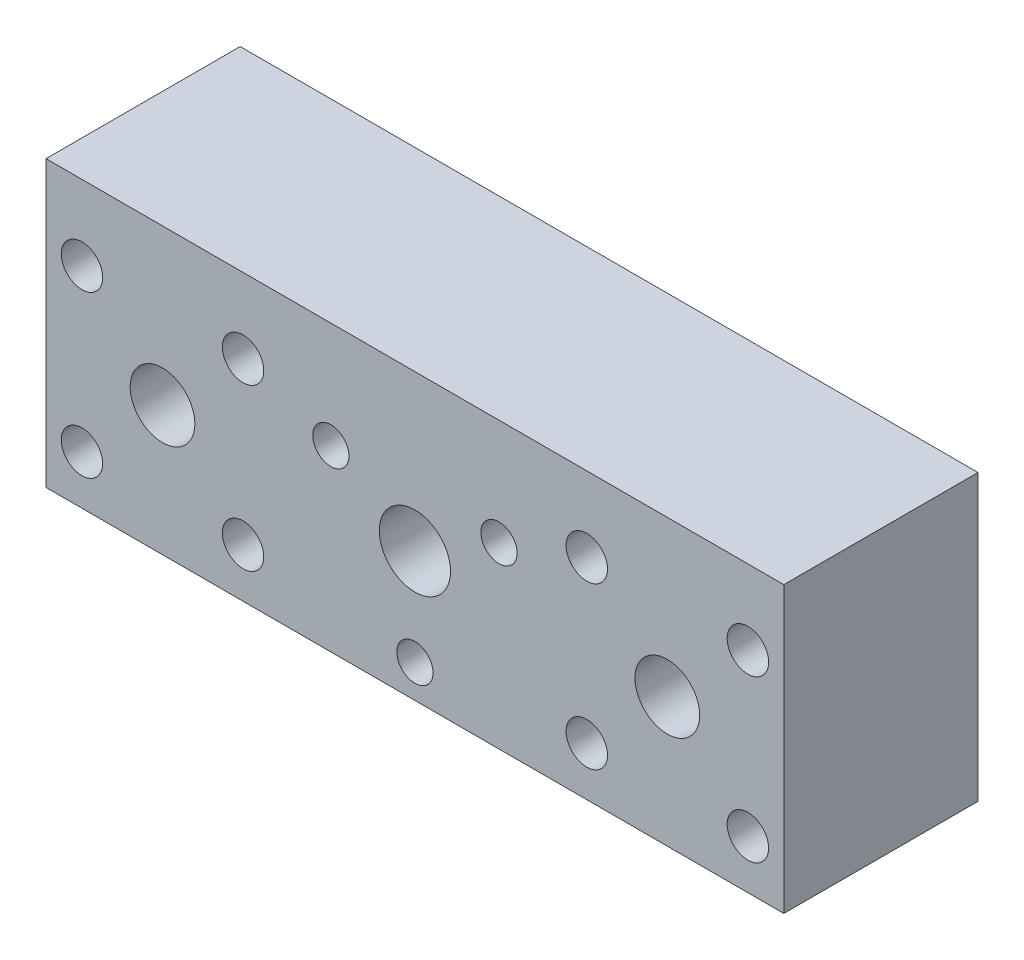
ISO-10303-21;
HEADER;
FILE_DESCRIPTION(('STEP AP214'),'2;1');
FILE_NAME('part.step','',(''),(''),'','','');
FILE_SCHEMA(('AUTOMOTIVE_DESIGN { 1 0 10303 214 1 1 1 1 }'));
ENDSEC;
DATA;
#1=APPLICATION_CONTEXT('core data for automotive mechanical design processes');
#2=APPLICATION_PROTOCOL_DEFINITION('international standard','automotive_design',2000,#1);
#3=PRODUCT_CONTEXT('',#1,'mechanical');
#4=PRODUCT('Part','Part','',(#3));
#5=PRODUCT_RELATED_PRODUCT_CATEGORY('part','',(#4));
#6=PRODUCT_DEFINITION_FORMATION('','',#4);
#7=PRODUCT_DEFINITION_CONTEXT('part definition',#1,'design');
#8=PRODUCT_DEFINITION('design','',#6,#7);
#9=PRODUCT_DEFINITION_SHAPE('','',#8);
#10=(LENGTH_UNIT() NAMED_UNIT(*) SI_UNIT(.MILLI.,.METRE.));
#11=(NAMED_UNIT(*) PLANE_ANGLE_UNIT() SI_UNIT($,.RADIAN.));
#12=(NAMED_UNIT(*) SI_UNIT($,.STERADIAN.) SOLID_ANGLE_UNIT());
#13=UNCERTAINTY_MEASURE_WITH_UNIT(LENGTH_MEASURE(1.E-05),#10,'distance_accuracy_value','');
#14=(GEOMETRIC_REPRESENTATION_CONTEXT(3) GLOBAL_UNCERTAINTY_ASSIGNED_CONTEXT((#13)) GLOBAL_UNIT_ASSIGNED_CONTEXT((#10,
#11,#12)) REPRESENTATION_CONTEXT('',''));
#15=CARTESIAN_POINT('',(0.,0.,0.));
#16=DIRECTION('',(0.,0.,1.));
#17=DIRECTION('',(1.,0.,0.));
#18=AXIS2_PLACEMENT_3D('',#15,#16,#17);
#19=CARTESIAN_POINT('',(-36.195,11.43,6.35));
#20=DIRECTION('',(1.,0.,0.));
#21=DIRECTION('',(0.,0.,-1.));
#22=AXIS2_PLACEMENT_3D('',#19,#20,#21);
#23=PLANE('',#22);
#24=DIRECTION('',(0.,0.,1.));
#25=VECTOR('',#24,1.);
#26=CARTESIAN_POINT('',(-36.195,15.24,0.));
#27=LINE('',#26,#25);
#28=CARTESIAN_POINT('',(-36.195,15.24,-12.7));
#29=VERTEX_POINT('',#28);
#30=CARTESIAN_POINT('',(-36.195,15.24,6.35));
#31=VERTEX_POINT('',#30);
#32=EDGE_CURVE('E86',#29,#31,#27,.T.);
#33=ORIENTED_EDGE('',*,*,#32,.F.);
#34=DIRECTION('',(0.,1.,0.));
#35=VECTOR('',#34,1.);
#36=CARTESIAN_POINT('',(-36.195,15.24,-12.7));
#37=LINE('',#36,#35);
#38=CARTESIAN_POINT('',(-36.195,-12.7,-12.7));
#39=VERTEX_POINT('',#38);
#40=EDGE_CURVE('E87',#39,#29,#37,.T.);
#41=ORIENTED_EDGE('',*,*,#40,.F.);
#42=DIRECTION('',(0.,0.,-1.));
#43=VECTOR('',#42,1.);
#44=CARTESIAN_POINT('',(-36.195,-12.7,6.35));
#45=LINE('',#44,#43);
#46=CARTESIAN_POINT('',(-36.195,-12.7,6.35));
#47=VERTEX_POINT('',#46);
#48=EDGE_CURVE('E120',#47,#39,#45,.T.);
#49=ORIENTED_EDGE('',*,*,#48,.F.);
#50=DIRECTION('',(0.,-1.,0.));
#51=VECTOR('',#50,1.);
#52=CARTESIAN_POINT('',(-36.195,11.43,6.35));
#53=LINE('',#52,#51);
#54=EDGE_CURVE('E47',#31,#47,#53,.T.);
#55=ORIENTED_EDGE('',*,*,#54,.F.);
#56=EDGE_LOOP('',(#33,#41,#49,#55));
#57=FACE_BOUND('',#56,.T.);
#58=ADVANCED_FACE('F39',(#57),#23,.F.);
#59=CARTESIAN_POINT('',(36.195,11.43,6.35));
#60=DIRECTION('',(1.,0.,0.));
#61=DIRECTION('',(0.,0.,-1.));
#62=AXIS2_PLACEMENT_3D('',#59,#60,#61);
#63=PLANE('',#62);
#64=DIRECTION('',(0.,0.,1.));
#65=VECTOR('',#64,1.);
#66=CARTESIAN_POINT('',(36.195,-12.7,0.));
#67=LINE('',#66,#65);
#68=CARTESIAN_POINT('',(36.195,-12.7,-12.7));
#69=VERTEX_POINT('',#68);
#70=CARTESIAN_POINT('',(36.195,-12.7,6.35));
#71=VERTEX_POINT('',#70);
#72=EDGE_CURVE('E92',#69,#71,#67,.T.);
#73=ORIENTED_EDGE('',*,*,#72,.F.);
#74=DIRECTION('',(0.,-1.,0.));
#75=VECTOR('',#74,1.);
#76=CARTESIAN_POINT('',(36.195,15.24,-12.7));
#77=LINE('',#76,#75);
#78=CARTESIAN_POINT('',(36.195,15.24,-12.7));
#79=VERTEX_POINT('',#78);
#80=EDGE_CURVE('E90',#79,#69,#77,.T.);
#81=ORIENTED_EDGE('',*,*,#80,.F.);
#82=DIRECTION('',(0.,0.,-1.));
#83=VECTOR('',#82,1.);
#84=CARTESIAN_POINT('',(36.195,15.24,6.35));
#85=LINE('',#84,#83);
#86=CARTESIAN_POINT('',(36.195,15.24,6.35));
#87=VERTEX_POINT('',#86);
#88=EDGE_CURVE('E78',#87,#79,#85,.T.);
#89=ORIENTED_EDGE('',*,*,#88,.F.);
#90=DIRECTION('',(0.,-1.,0.));
#91=VECTOR('',#90,1.);
#92=CARTESIAN_POINT('',(36.195,11.43,6.35));
#93=LINE('',#92,#91);
#94=EDGE_CURVE('E11',#87,#71,#93,.T.);
#95=ORIENTED_EDGE('',*,*,#94,.T.);
#96=EDGE_LOOP('',(#73,#81,#89,#95));
#97=FACE_BOUND('',#96,.T.);
#98=ADVANCED_FACE('F91',(#97),#63,.T.);
#99=CARTESIAN_POINT('',(0.,0.,6.35));
#100=DIRECTION('',(0.,0.,1.));
#101=DIRECTION('',(1.,0.,0.));
#102=AXIS2_PLACEMENT_3D('',#99,#100,#101);
#103=PLANE('',#102);
#104=CARTESIAN_POINT('',(8.24864999999999,4.826,6.35));
#105=DIRECTION('',(0.,0.,1.));
#106=DIRECTION('',(1.,0.,0.));
#107=AXIS2_PLACEMENT_3D('',#104,#105,#106);
#108=CIRCLE('',#107,1.778);
#109=CARTESIAN_POINT('',(10.02665,4.826,6.35));
#110=VERTEX_POINT('',#109);
#111=EDGE_CURVE('E134',#110,#110,#108,.T.);
#112=ORIENTED_EDGE('',*,*,#111,.F.);
#113=EDGE_LOOP('',(#112));
#114=FACE_BOUND('',#113,.T.);
#115=CARTESIAN_POINT('',(-8.24865000000001,4.826,6.35));
#116=DIRECTION('',(0.,0.,1.));
#117=DIRECTION('',(1.,0.,0.));
#118=AXIS2_PLACEMENT_3D('',#115,#116,#117);
#119=CIRCLE('',#118,1.778);
#120=CARTESIAN_POINT('',(-6.47065000000001,4.826,6.35));
#121=VERTEX_POINT('',#120);
#122=EDGE_CURVE('E142',#121,#121,#119,.T.);
#123=ORIENTED_EDGE('',*,*,#122,.F.);
#124=EDGE_LOOP('',(#123));
#125=FACE_BOUND('',#124,.T.);
#126=CARTESIAN_POINT('',(0.,-9.46108089385302,6.35));
#127=DIRECTION('',(0.,0.,1.));
#128=DIRECTION('',(1.,0.,0.));
#129=AXIS2_PLACEMENT_3D('',#126,#127,#128);
#130=CIRCLE('',#129,1.778);
#131=CARTESIAN_POINT('',(1.778,-9.46108089385302,6.35));
#132=VERTEX_POINT('',#131);
#133=EDGE_CURVE('E128',#132,#132,#130,.T.);
#134=ORIENTED_EDGE('',*,*,#133,.F.);
#135=EDGE_LOOP('',(#134));
#136=FACE_BOUND('',#135,.T.);
#137=CARTESIAN_POINT('',(-16.862374613459,7.90262538654075,6.35));
#138=DIRECTION('',(0.,0.,1.));
#139=DIRECTION('',(-1.,0.,0.));
#140=AXIS2_PLACEMENT_3D('',#137,#138,#139);
#141=CIRCLE('',#140,2.032);
#142=CARTESIAN_POINT('',(-18.894374613459,7.90262538654075,6.35));
#143=VERTEX_POINT('',#142);
#144=EDGE_CURVE('E165',#143,#143,#141,.T.);
#145=ORIENTED_EDGE('',*,*,#144,.F.);
#146=EDGE_LOOP('',(#145));
#147=FACE_BOUND('',#146,.T.);
#148=CARTESIAN_POINT('',(16.862374613459,-7.90262538654075,6.35));
#149=DIRECTION('',(0.,0.,1.));
#150=DIRECTION('',(-1.,0.,0.));
#151=AXIS2_PLACEMENT_3D('',#148,#149,#150);
#152=CIRCLE('',#151,2.032);
#153=CARTESIAN_POINT('',(14.830374613459,-7.90262538654075,6.35));
#154=VERTEX_POINT('',#153);
#155=EDGE_CURVE('E182',#154,#154,#152,.T.);
#156=ORIENTED_EDGE('',*,*,#155,.F.);
#157=EDGE_LOOP('',(#156));
#158=FACE_BOUND('',#157,.T.);
#159=CARTESIAN_POINT('',(16.862374613459,7.90262538654075,6.35));
#160=DIRECTION('',(0.,0.,1.));
#161=DIRECTION('',(1.,0.,0.));
#162=AXIS2_PLACEMENT_3D('',#159,#160,#161);
#163=CIRCLE('',#162,2.032);
#164=CARTESIAN_POINT('',(18.894374613459,7.90262538654075,6.35));
#165=VERTEX_POINT('',#164);
#166=EDGE_CURVE('E181',#165,#165,#163,.T.);
#167=ORIENTED_EDGE('',*,*,#166,.F.);
#168=EDGE_LOOP('',(#167));
#169=FACE_BOUND('',#168,.T.);
#170=CARTESIAN_POINT('',(32.667625386541,7.90262538654075,6.35));
#171=DIRECTION('',(0.,0.,1.));
#172=DIRECTION('',(-1.,0.,0.));
#173=AXIS2_PLACEMENT_3D('',#170,#171,#172);
#174=CIRCLE('',#173,2.032);
#175=CARTESIAN_POINT('',(30.635625386541,7.90262538654075,6.35));
#176=VERTEX_POINT('',#175);
#177=EDGE_CURVE('E198',#176,#176,#174,.T.);
#178=ORIENTED_EDGE('',*,*,#177,.F.);
#179=EDGE_LOOP('',(#178));
#180=FACE_BOUND('',#179,.T.);
#181=CARTESIAN_POINT('',(-32.667625386541,-7.90262538654075,6.35));
#182=DIRECTION('',(0.,0.,1.));
#183=DIRECTION('',(-1.,0.,0.));
#184=AXIS2_PLACEMENT_3D('',#181,#182,#183);
#185=CIRCLE('',#184,2.032);
#186=CARTESIAN_POINT('',(-34.699625386541,-7.90262538654075,6.35));
#187=VERTEX_POINT('',#186);
#188=EDGE_CURVE('E133',#187,#187,#185,.T.);
#189=ORIENTED_EDGE('',*,*,#188,.F.);
#190=EDGE_LOOP('',(#189));
#191=FACE_BOUND('',#190,.T.);
#192=CARTESIAN_POINT('',(-16.862374613459,-7.90262538654075,6.35));
#193=DIRECTION('',(0.,0.,1.));
#194=DIRECTION('',(1.,0.,0.));
#195=AXIS2_PLACEMENT_3D('',#192,#193,#194);
#196=CIRCLE('',#195,2.032);
#197=CARTESIAN_POINT('',(-14.830374613459,-7.90262538654075,6.35));
#198=VERTEX_POINT('',#197);
#199=EDGE_CURVE('E157',#198,#198,#196,.T.);
#200=ORIENTED_EDGE('',*,*,#199,.F.);
#201=EDGE_LOOP('',(#200));
#202=FACE_BOUND('',#201,.T.);
#203=CARTESIAN_POINT('',(-32.667625386541,7.90262538654075,6.35));
#204=DIRECTION('',(0.,0.,1.));
#205=DIRECTION('',(1.,0.,0.));
#206=AXIS2_PLACEMENT_3D('',#203,#204,#205);
#207=CIRCLE('',#206,2.032);
#208=CARTESIAN_POINT('',(-30.635625386541,7.90262538654075,6.35));
#209=VERTEX_POINT('',#208);
#210=EDGE_CURVE('E166',#209,#209,#207,.T.);
#211=ORIENTED_EDGE('',*,*,#210,.F.);
#212=EDGE_LOOP('',(#211));
#213=FACE_BOUND('',#212,.T.);
#214=CARTESIAN_POINT('',(32.667625386541,-7.90262538654075,6.35));
#215=DIRECTION('',(0.,0.,1.));
#216=DIRECTION('',(1.,0.,0.));
#217=AXIS2_PLACEMENT_3D('',#214,#215,#216);
#218=CIRCLE('',#217,2.032);
#219=CARTESIAN_POINT('',(34.699625386541,-7.90262538654075,6.35));
#220=VERTEX_POINT('',#219);
#221=EDGE_CURVE('E197',#220,#220,#218,.T.);
#222=ORIENTED_EDGE('',*,*,#221,.F.);
#223=EDGE_LOOP('',(#222));
#224=FACE_BOUND('',#223,.T.);
#225=CARTESIAN_POINT('',(-24.765,0.,6.35));
#226=DIRECTION('',(0.,0.,1.));
#227=DIRECTION('',(1.,0.,0.));
#228=AXIS2_PLACEMENT_3D('',#225,#226,#227);
#229=CIRCLE('',#228,3.175);
#230=CARTESIAN_POINT('',(-21.59,0.,6.35));
#231=VERTEX_POINT('',#230);
#232=EDGE_CURVE('E224',#231,#231,#229,.F.);
#233=ORIENTED_EDGE('',*,*,#232,.T.);
#234=EDGE_LOOP('',(#233));
#235=FACE_BOUND('',#234,.T.);
#236=CARTESIAN_POINT('',(24.765,0.,6.35));
#237=DIRECTION('',(0.,0.,1.));
#238=DIRECTION('',(1.,0.,0.));
#239=AXIS2_PLACEMENT_3D('',#236,#237,#238);
#240=CIRCLE('',#239,3.175);
#241=CARTESIAN_POINT('',(27.94,0.,6.35));
#242=VERTEX_POINT('',#241);
#243=EDGE_CURVE('E220',#242,#242,#240,.F.);
#244=ORIENTED_EDGE('',*,*,#243,.T.);
#245=EDGE_LOOP('',(#244));
#246=FACE_BOUND('',#245,.T.);
#247=CARTESIAN_POINT('',(0.,0.,6.35));
#248=DIRECTION('',(0.,0.,1.));
#249=DIRECTION('',(1.,0.,0.));
#250=AXIS2_PLACEMENT_3D('',#247,#248,#249);
#251=CIRCLE('',#250,3.4925);
#252=CARTESIAN_POINT('',(3.4925,0.,6.35));
#253=VERTEX_POINT('',#252);
#254=EDGE_CURVE('E213',#253,#253,#251,.F.);
#255=ORIENTED_EDGE('',*,*,#254,.T.);
#256=EDGE_LOOP('',(#255));
#257=FACE_BOUND('',#256,.T.);
#258=ORIENTED_EDGE('',*,*,#54,.T.);
#259=DIRECTION('',(-1.,0.,0.));
#260=VECTOR('',#259,1.);
#261=CARTESIAN_POINT('',(36.195,-12.7,6.35));
#262=LINE('',#261,#260);
#263=EDGE_CURVE('E125',#71,#47,#262,.T.);
#264=ORIENTED_EDGE('',*,*,#263,.F.);
#265=ORIENTED_EDGE('',*,*,#94,.F.);
#266=DIRECTION('',(1.,0.,0.));
#267=VECTOR('',#266,1.);
#268=CARTESIAN_POINT('',(-36.195,15.24,6.35));
#269=LINE('',#268,#267);
#270=EDGE_CURVE('E84',#31,#87,#269,.T.);
#271=ORIENTED_EDGE('',*,*,#270,.F.);
#272=EDGE_LOOP('',(#258,#264,#265,#271));
#273=FACE_BOUND('',#272,.T.);
#274=ADVANCED_FACE('F230',(#114,#125,#136,#147,#158,#169,#180,#191,#202,#213,#224,#235,#246,
#257,#273),#103,.T.);
#275=CARTESIAN_POINT('',(0.,0.,12.7));
#276=DIRECTION('',(0.,0.,-1.));
#277=DIRECTION('',(-1.,0.,0.));
#278=AXIS2_PLACEMENT_3D('',#275,#276,#277);
#279=CYLINDRICAL_SURFACE('',#278,3.4925);
#280=ORIENTED_EDGE('',*,*,#254,.F.);
#281=EDGE_LOOP('',(#280));
#282=FACE_BOUND('',#281,.T.);
#283=CARTESIAN_POINT('',(0.,0.,-12.7));
#284=DIRECTION('',(0.,0.,-1.));
#285=DIRECTION('',(-1.,0.,0.));
#286=AXIS2_PLACEMENT_3D('',#283,#284,#285);
#287=CIRCLE('',#286,3.4925);
#288=CARTESIAN_POINT('',(-3.4925,0.,-12.7));
#289=VERTEX_POINT('',#288);
#290=EDGE_CURVE('E108',#289,#289,#287,.T.);
#291=ORIENTED_EDGE('',*,*,#290,.T.);
#292=EDGE_LOOP('',(#291));
#293=FACE_BOUND('',#292,.T.);
#294=ADVANCED_FACE('F249',(#282,#293),#279,.F.);
#295=CARTESIAN_POINT('',(24.765,0.,12.7));
#296=DIRECTION('',(0.,0.,-1.));
#297=DIRECTION('',(-1.,0.,0.));
#298=AXIS2_PLACEMENT_3D('',#295,#296,#297);
#299=CYLINDRICAL_SURFACE('',#298,3.175);
#300=ORIENTED_EDGE('',*,*,#243,.F.);
#301=EDGE_LOOP('',(#300));
#302=FACE_BOUND('',#301,.T.);
#303=CARTESIAN_POINT('',(24.765,0.,-12.7));
#304=DIRECTION('',(0.,0.,-1.));
#305=DIRECTION('',(-1.,0.,0.));
#306=AXIS2_PLACEMENT_3D('',#303,#304,#305);
#307=CIRCLE('',#306,3.175);
#308=CARTESIAN_POINT('',(21.59,0.,-12.7));
#309=VERTEX_POINT('',#308);
#310=EDGE_CURVE('E104',#309,#309,#307,.T.);
#311=ORIENTED_EDGE('',*,*,#310,.T.);
#312=EDGE_LOOP('',(#311));
#313=FACE_BOUND('',#312,.T.);
#314=ADVANCED_FACE('F237',(#302,#313),#299,.F.);
#315=CARTESIAN_POINT('',(-24.765,0.,12.7));
#316=DIRECTION('',(0.,0.,-1.));
#317=DIRECTION('',(-1.,0.,0.));
#318=AXIS2_PLACEMENT_3D('',#315,#316,#317);
#319=CYLINDRICAL_SURFACE('',#318,3.175);
#320=ORIENTED_EDGE('',*,*,#232,.F.);
#321=EDGE_LOOP('',(#320));
#322=FACE_BOUND('',#321,.T.);
#323=CARTESIAN_POINT('',(-24.765,0.,-12.7));
#324=DIRECTION('',(0.,0.,-1.));
#325=DIRECTION('',(-1.,0.,0.));
#326=AXIS2_PLACEMENT_3D('',#323,#324,#325);
#327=CIRCLE('',#326,3.175);
#328=CARTESIAN_POINT('',(-27.94,0.,-12.7));
#329=VERTEX_POINT('',#328);
#330=EDGE_CURVE('E241',#329,#329,#327,.T.);
#331=ORIENTED_EDGE('',*,*,#330,.T.);
#332=EDGE_LOOP('',(#331));
#333=FACE_BOUND('',#332,.T.);
#334=ADVANCED_FACE('F233',(#322,#333),#319,.F.);
#335=CARTESIAN_POINT('',(32.667625386541,-7.90262538654075,0.));
#336=DIRECTION('',(0.,0.,1.));
#337=DIRECTION('',(1.,0.,0.));
#338=AXIS2_PLACEMENT_3D('',#335,#336,#337);
#339=CYLINDRICAL_SURFACE('',#338,2.032);
#340=CARTESIAN_POINT('',(32.667625386541,-7.90262538654075,0.));
#341=DIRECTION('',(0.,0.,1.));
#342=DIRECTION('',(1.,0.,0.));
#343=AXIS2_PLACEMENT_3D('',#340,#341,#342);
#344=CIRCLE('',#343,2.032);
#345=CARTESIAN_POINT('',(34.699625386541,-7.90262538654075,0.));
#346=VERTEX_POINT('',#345);
#347=EDGE_CURVE('E209',#346,#346,#344,.T.);
#348=ORIENTED_EDGE('',*,*,#347,.F.);
#349=EDGE_LOOP('',(#348));
#350=FACE_BOUND('',#349,.T.);
#351=ORIENTED_EDGE('',*,*,#221,.T.);
#352=EDGE_LOOP('',(#351));
#353=FACE_BOUND('',#352,.T.);
#354=ADVANCED_FACE('F236',(#350,#353),#339,.F.);
#355=CARTESIAN_POINT('',(-32.667625386541,7.90262538654075,0.));
#356=DIRECTION('',(0.,0.,1.));
#357=DIRECTION('',(1.,0.,0.));
#358=AXIS2_PLACEMENT_3D('',#355,#356,#357);
#359=CYLINDRICAL_SURFACE('',#358,2.032);
#360=CARTESIAN_POINT('',(-32.667625386541,7.90262538654075,0.));
#361=DIRECTION('',(0.,0.,1.));
#362=DIRECTION('',(1.,0.,0.));
#363=AXIS2_PLACEMENT_3D('',#360,#361,#362);
#364=CIRCLE('',#363,2.032);
#365=CARTESIAN_POINT('',(-30.635625386541,7.90262538654075,0.));
#366=VERTEX_POINT('',#365);
#367=EDGE_CURVE('E161',#366,#366,#364,.T.);
#368=ORIENTED_EDGE('',*,*,#367,.F.);
#369=EDGE_LOOP('',(#368));
#370=FACE_BOUND('',#369,.T.);
#371=ORIENTED_EDGE('',*,*,#210,.T.);
#372=EDGE_LOOP('',(#371));
#373=FACE_BOUND('',#372,.T.);
#374=ADVANCED_FACE('F295',(#370,#373),#359,.F.);
#375=CARTESIAN_POINT('',(-16.862374613459,-7.90262538654075,0.));
#376=DIRECTION('',(0.,0.,1.));
#377=DIRECTION('',(1.,0.,0.));
#378=AXIS2_PLACEMENT_3D('',#375,#376,#377);
#379=CYLINDRICAL_SURFACE('',#378,2.032);
#380=CARTESIAN_POINT('',(-16.862374613459,-7.90262538654075,0.));
#381=DIRECTION('',(0.,0.,1.));
#382=DIRECTION('',(1.,0.,0.));
#383=AXIS2_PLACEMENT_3D('',#380,#381,#382);
#384=CIRCLE('',#383,2.032);
#385=CARTESIAN_POINT('',(-14.830374613459,-7.90262538654075,0.));
#386=VERTEX_POINT('',#385);
#387=EDGE_CURVE('E170',#386,#386,#384,.T.);
#388=ORIENTED_EDGE('',*,*,#387,.F.);
#389=EDGE_LOOP('',(#388));
#390=FACE_BOUND('',#389,.T.);
#391=ORIENTED_EDGE('',*,*,#199,.T.);
#392=EDGE_LOOP('',(#391));
#393=FACE_BOUND('',#392,.T.);
#394=ADVANCED_FACE('F293',(#390,#393),#379,.F.);
#395=CARTESIAN_POINT('',(-32.667625386541,-7.90262538654075,0.));
#396=DIRECTION('',(0.,0.,1.));
#397=DIRECTION('',(1.,0.,0.));
#398=AXIS2_PLACEMENT_3D('',#395,#396,#397);
#399=CYLINDRICAL_SURFACE('',#398,2.032);
#400=CARTESIAN_POINT('',(-32.667625386541,-7.90262538654075,0.));
#401=DIRECTION('',(0.,0.,1.));
#402=DIRECTION('',(-1.,0.,0.));
#403=AXIS2_PLACEMENT_3D('',#400,#401,#402);
#404=CIRCLE('',#403,2.032);
#405=CARTESIAN_POINT('',(-34.699625386541,-7.90262538654075,0.));
#406=VERTEX_POINT('',#405);
#407=EDGE_CURVE('E153',#406,#406,#404,.T.);
#408=ORIENTED_EDGE('',*,*,#407,.F.);
#409=EDGE_LOOP('',(#408));
#410=FACE_BOUND('',#409,.T.);
#411=ORIENTED_EDGE('',*,*,#188,.T.);
#412=EDGE_LOOP('',(#411));
#413=FACE_BOUND('',#412,.T.);
#414=ADVANCED_FACE('F289',(#410,#413),#399,.F.);
#415=CARTESIAN_POINT('',(32.667625386541,7.90262538654075,0.));
#416=DIRECTION('',(0.,0.,1.));
#417=DIRECTION('',(1.,0.,0.));
#418=AXIS2_PLACEMENT_3D('',#415,#416,#417);
#419=CYLINDRICAL_SURFACE('',#418,2.032);
#420=CARTESIAN_POINT('',(32.667625386541,7.90262538654075,0.));
#421=DIRECTION('',(0.,0.,1.));
#422=DIRECTION('',(-1.,0.,0.));
#423=AXIS2_PLACEMENT_3D('',#420,#421,#422);
#424=CIRCLE('',#423,2.032);
#425=CARTESIAN_POINT('',(30.635625386541,7.90262538654075,0.));
#426=VERTEX_POINT('',#425);
#427=EDGE_CURVE('E193',#426,#426,#424,.T.);
#428=ORIENTED_EDGE('',*,*,#427,.F.);
#429=EDGE_LOOP('',(#428));
#430=FACE_BOUND('',#429,.T.);
#431=ORIENTED_EDGE('',*,*,#177,.T.);
#432=EDGE_LOOP('',(#431));
#433=FACE_BOUND('',#432,.T.);
#434=ADVANCED_FACE('F292',(#430,#433),#419,.F.);
#435=CARTESIAN_POINT('',(16.862374613459,7.90262538654075,0.));
#436=DIRECTION('',(0.,0.,1.));
#437=DIRECTION('',(1.,0.,0.));
#438=AXIS2_PLACEMENT_3D('',#435,#436,#437);
#439=CYLINDRICAL_SURFACE('',#438,2.032);
#440=CARTESIAN_POINT('',(16.862374613459,7.90262538654075,0.));
#441=DIRECTION('',(0.,0.,1.));
#442=DIRECTION('',(1.,0.,0.));
#443=AXIS2_PLACEMENT_3D('',#440,#441,#442);
#444=CIRCLE('',#443,2.032);
#445=CARTESIAN_POINT('',(18.894374613459,7.90262538654075,0.));
#446=VERTEX_POINT('',#445);
#447=EDGE_CURVE('E202',#446,#446,#444,.T.);
#448=ORIENTED_EDGE('',*,*,#447,.F.);
#449=EDGE_LOOP('',(#448));
#450=FACE_BOUND('',#449,.T.);
#451=ORIENTED_EDGE('',*,*,#166,.T.);
#452=EDGE_LOOP('',(#451));
#453=FACE_BOUND('',#452,.T.);
#454=ADVANCED_FACE('F305',(#450,#453),#439,.F.);
#455=CARTESIAN_POINT('',(16.862374613459,-7.90262538654075,0.));
#456=DIRECTION('',(0.,0.,1.));
#457=DIRECTION('',(1.,0.,0.));
#458=AXIS2_PLACEMENT_3D('',#455,#456,#457);
#459=CYLINDRICAL_SURFACE('',#458,2.032);
#460=CARTESIAN_POINT('',(16.862374613459,-7.90262538654075,0.));
#461=DIRECTION('',(0.,0.,1.));
#462=DIRECTION('',(-1.,0.,0.));
#463=AXIS2_PLACEMENT_3D('',#460,#461,#462);
#464=CIRCLE('',#463,2.032);
#465=CARTESIAN_POINT('',(14.830374613459,-7.90262538654075,0.));
#466=VERTEX_POINT('',#465);
#467=EDGE_CURVE('E177',#466,#466,#464,.T.);
#468=ORIENTED_EDGE('',*,*,#467,.F.);
#469=EDGE_LOOP('',(#468));
#470=FACE_BOUND('',#469,.T.);
#471=ORIENTED_EDGE('',*,*,#155,.T.);
#472=EDGE_LOOP('',(#471));
#473=FACE_BOUND('',#472,.T.);
#474=ADVANCED_FACE('F302',(#470,#473),#459,.F.);
#475=CARTESIAN_POINT('',(-16.862374613459,7.90262538654075,0.));
#476=DIRECTION('',(0.,0.,1.));
#477=DIRECTION('',(1.,0.,0.));
#478=AXIS2_PLACEMENT_3D('',#475,#476,#477);
#479=CYLINDRICAL_SURFACE('',#478,2.032);
#480=CARTESIAN_POINT('',(-16.862374613459,7.90262538654075,0.));
#481=DIRECTION('',(0.,0.,1.));
#482=DIRECTION('',(-1.,0.,0.));
#483=AXIS2_PLACEMENT_3D('',#480,#481,#482);
#484=CIRCLE('',#483,2.032);
#485=CARTESIAN_POINT('',(-18.894374613459,7.90262538654075,0.));
#486=VERTEX_POINT('',#485);
#487=EDGE_CURVE('E186',#486,#486,#484,.T.);
#488=ORIENTED_EDGE('',*,*,#487,.F.);
#489=EDGE_LOOP('',(#488));
#490=FACE_BOUND('',#489,.T.);
#491=ORIENTED_EDGE('',*,*,#144,.T.);
#492=EDGE_LOOP('',(#491));
#493=FACE_BOUND('',#492,.T.);
#494=ADVANCED_FACE('F287',(#490,#493),#479,.F.);
#495=CARTESIAN_POINT('',(0.,-9.46108089385302,0.));
#496=DIRECTION('',(0.,0.,1.));
#497=DIRECTION('',(1.,0.,0.));
#498=AXIS2_PLACEMENT_3D('',#495,#496,#497);
#499=CYLINDRICAL_SURFACE('',#498,1.778);
#500=CARTESIAN_POINT('',(0.,-9.46108089385302,0.));
#501=DIRECTION('',(0.,0.,1.));
#502=DIRECTION('',(1.,0.,0.));
#503=AXIS2_PLACEMENT_3D('',#500,#501,#502);
#504=CIRCLE('',#503,1.778);
#505=CARTESIAN_POINT('',(1.778,-9.46108089385302,0.));
#506=VERTEX_POINT('',#505);
#507=EDGE_CURVE('E146',#506,#506,#504,.T.);
#508=ORIENTED_EDGE('',*,*,#507,.F.);
#509=EDGE_LOOP('',(#508));
#510=FACE_BOUND('',#509,.T.);
#511=ORIENTED_EDGE('',*,*,#133,.T.);
#512=EDGE_LOOP('',(#511));
#513=FACE_BOUND('',#512,.T.);
#514=ADVANCED_FACE('F283',(#510,#513),#499,.F.);
#515=CARTESIAN_POINT('',(-8.24865000000001,4.826,0.));
#516=DIRECTION('',(0.,0.,1.));
#517=DIRECTION('',(1.,0.,0.));
#518=AXIS2_PLACEMENT_3D('',#515,#516,#517);
#519=CYLINDRICAL_SURFACE('',#518,1.778);
#520=CARTESIAN_POINT('',(-8.24865000000001,4.826,0.));
#521=DIRECTION('',(0.,0.,1.));
#522=DIRECTION('',(1.,0.,0.));
#523=AXIS2_PLACEMENT_3D('',#520,#521,#522);
#524=CIRCLE('',#523,1.778);
#525=CARTESIAN_POINT('',(-6.47065000000001,4.826,0.));
#526=VERTEX_POINT('',#525);
#527=EDGE_CURVE('E138',#526,#526,#524,.T.);
#528=ORIENTED_EDGE('',*,*,#527,.F.);
#529=EDGE_LOOP('',(#528));
#530=FACE_BOUND('',#529,.T.);
#531=ORIENTED_EDGE('',*,*,#122,.T.);
#532=EDGE_LOOP('',(#531));
#533=FACE_BOUND('',#532,.T.);
#534=ADVANCED_FACE('F277',(#530,#533),#519,.F.);
#535=CARTESIAN_POINT('',(8.24864999999999,4.826,0.));
#536=DIRECTION('',(0.,0.,1.));
#537=DIRECTION('',(1.,0.,0.));
#538=AXIS2_PLACEMENT_3D('',#535,#536,#537);
#539=CYLINDRICAL_SURFACE('',#538,1.778);
#540=CARTESIAN_POINT('',(8.24864999999999,4.826,0.));
#541=DIRECTION('',(0.,0.,1.));
#542=DIRECTION('',(1.,0.,0.));
#543=AXIS2_PLACEMENT_3D('',#540,#541,#542);
#544=CIRCLE('',#543,1.778);
#545=CARTESIAN_POINT('',(10.02665,4.826,0.));
#546=VERTEX_POINT('',#545);
#547=EDGE_CURVE('E129',#546,#546,#544,.T.);
#548=ORIENTED_EDGE('',*,*,#547,.F.);
#549=EDGE_LOOP('',(#548));
#550=FACE_BOUND('',#549,.T.);
#551=ORIENTED_EDGE('',*,*,#111,.T.);
#552=EDGE_LOOP('',(#551));
#553=FACE_BOUND('',#552,.T.);
#554=ADVANCED_FACE('F270',(#550,#553),#539,.F.);
#555=CARTESIAN_POINT('',(0.,-12.7,0.));
#556=DIRECTION('',(0.,-1.,0.));
#557=DIRECTION('',(0.,0.,-1.));
#558=AXIS2_PLACEMENT_3D('',#555,#556,#557);
#559=PLANE('',#558);
#560=ORIENTED_EDGE('',*,*,#48,.T.);
#561=DIRECTION('',(-1.,0.,0.));
#562=VECTOR('',#561,1.);
#563=CARTESIAN_POINT('',(-36.195,-12.7,-12.7));
#564=LINE('',#563,#562);
#565=EDGE_CURVE('E97',#69,#39,#564,.T.);
#566=ORIENTED_EDGE('',*,*,#565,.F.);
#567=ORIENTED_EDGE('',*,*,#72,.T.);
#568=ORIENTED_EDGE('',*,*,#263,.T.);
#569=EDGE_LOOP('',(#560,#566,#567,#568));
#570=FACE_BOUND('',#569,.T.);
#571=ADVANCED_FACE('F268',(#570),#559,.T.);
#572=CARTESIAN_POINT('',(0.,15.24,0.));
#573=DIRECTION('',(0.,1.,0.));
#574=DIRECTION('',(0.,0.,1.));
#575=AXIS2_PLACEMENT_3D('',#572,#573,#574);
#576=PLANE('',#575);
#577=ORIENTED_EDGE('',*,*,#88,.T.);
#578=DIRECTION('',(1.,0.,0.));
#579=VECTOR('',#578,1.);
#580=CARTESIAN_POINT('',(36.195,15.24,-12.7));
#581=LINE('',#580,#579);
#582=EDGE_CURVE('E83',#29,#79,#581,.T.);
#583=ORIENTED_EDGE('',*,*,#582,.F.);
#584=ORIENTED_EDGE('',*,*,#32,.T.);
#585=ORIENTED_EDGE('',*,*,#270,.T.);
#586=EDGE_LOOP('',(#577,#583,#584,#585));
#587=FACE_BOUND('',#586,.T.);
#588=ADVANCED_FACE('F80',(#587),#576,.T.);
#589=CARTESIAN_POINT('',(0.,0.,0.));
#590=DIRECTION('',(0.,0.,1.));
#591=DIRECTION('',(1.,0.,0.));
#592=AXIS2_PLACEMENT_3D('',#589,#590,#591);
#593=PLANE('',#592);
#594=ORIENTED_EDGE('',*,*,#347,.T.);
#595=EDGE_LOOP('',(#594));
#596=FACE_BOUND('',#595,.T.);
#597=ADVANCED_FACE('F260',(#596),#593,.T.);
#598=ORIENTED_EDGE('',*,*,#367,.T.);
#599=EDGE_LOOP('',(#598));
#600=FACE_BOUND('',#599,.T.);
#601=ADVANCED_FACE('F478',(#600),#593,.T.);
#602=ORIENTED_EDGE('',*,*,#387,.T.);
#603=EDGE_LOOP('',(#602));
#604=FACE_BOUND('',#603,.T.);
#605=ADVANCED_FACE('F486',(#604),#593,.T.);
#606=ORIENTED_EDGE('',*,*,#407,.T.);
#607=EDGE_LOOP('',(#606));
#608=FACE_BOUND('',#607,.T.);
#609=ADVANCED_FACE('F494',(#608),#593,.T.);
#610=ORIENTED_EDGE('',*,*,#427,.T.);
#611=EDGE_LOOP('',(#610));
#612=FACE_BOUND('',#611,.T.);
#613=ADVANCED_FACE('F502',(#612),#593,.T.);
#614=ORIENTED_EDGE('',*,*,#447,.T.);
#615=EDGE_LOOP('',(#614));
#616=FACE_BOUND('',#615,.T.);
#617=ADVANCED_FACE('F510',(#616),#593,.T.);
#618=ORIENTED_EDGE('',*,*,#467,.T.);
#619=EDGE_LOOP('',(#618));
#620=FACE_BOUND('',#619,.T.);
#621=ADVANCED_FACE('F518',(#620),#593,.T.);
#622=ORIENTED_EDGE('',*,*,#487,.T.);
#623=EDGE_LOOP('',(#622));
#624=FACE_BOUND('',#623,.T.);
#625=ADVANCED_FACE('F526',(#624),#593,.T.);
#626=ORIENTED_EDGE('',*,*,#507,.T.);
#627=EDGE_LOOP('',(#626));
#628=FACE_BOUND('',#627,.T.);
#629=ADVANCED_FACE('F534',(#628),#593,.T.);
#630=ORIENTED_EDGE('',*,*,#527,.T.);
#631=EDGE_LOOP('',(#630));
#632=FACE_BOUND('',#631,.T.);
#633=ADVANCED_FACE('F257',(#632),#593,.T.);
#634=ORIENTED_EDGE('',*,*,#547,.T.);
#635=EDGE_LOOP('',(#634));
#636=FACE_BOUND('',#635,.T.);
#637=ADVANCED_FACE('F252',(#636),#593,.T.);
#638=CARTESIAN_POINT('',(0.,0.,-12.7));
#639=DIRECTION('',(0.,0.,1.));
#640=DIRECTION('',(1.,0.,0.));
#641=AXIS2_PLACEMENT_3D('',#638,#639,#640);
#642=PLANE('',#641);
#643=ORIENTED_EDGE('',*,*,#582,.T.);
#644=ORIENTED_EDGE('',*,*,#80,.T.);
#645=ORIENTED_EDGE('',*,*,#565,.T.);
#646=ORIENTED_EDGE('',*,*,#40,.T.);
#647=EDGE_LOOP('',(#643,#644,#645,#646));
#648=FACE_BOUND('',#647,.T.);
#649=ORIENTED_EDGE('',*,*,#310,.F.);
#650=EDGE_LOOP('',(#649));
#651=FACE_BOUND('',#650,.T.);
#652=ORIENTED_EDGE('',*,*,#290,.F.);
#653=EDGE_LOOP('',(#652));
#654=FACE_BOUND('',#653,.T.);
#655=ORIENTED_EDGE('',*,*,#330,.F.);
#656=EDGE_LOOP('',(#655));
#657=FACE_BOUND('',#656,.T.);
#658=ADVANCED_FACE('F100',(#648,#651,#654,#657),#642,.F.);
#659=CLOSED_SHELL('',(#58,#98,#274,#294,#314,#334,#354,#374,#394,#414,#434,#454,#474,#494,#514,
#534,#554,#571,#588,#597,#601,#605,#609,#613,#617,#621,#625,#629,#633,#637,#658));
#660=MANIFOLD_SOLID_BREP('B2',#659);
#661=ADVANCED_BREP_SHAPE_REPRESENTATION('',(#18,#660),#14);
#662=SHAPE_DEFINITION_REPRESENTATION(#9,#661);
ENDSEC;
END-ISO-10303-21;
